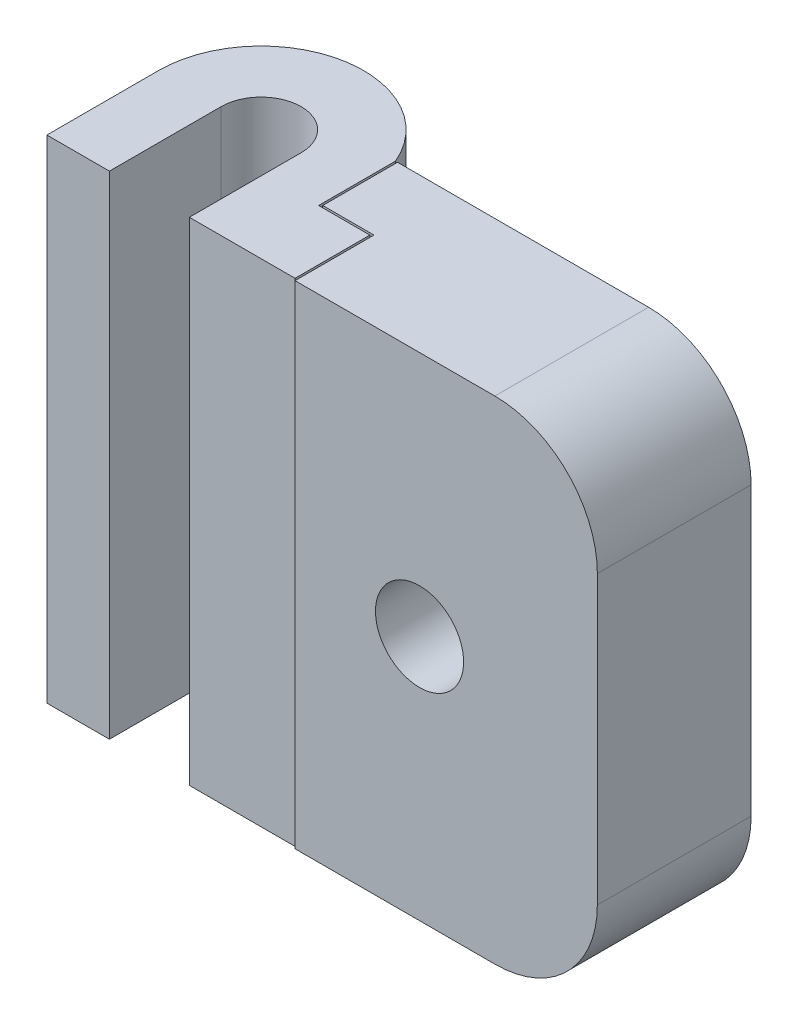
ISO-10303-21;
HEADER;
FILE_DESCRIPTION(('STEP AP214'),'2;1');
FILE_NAME('part.step','',(''),(''),'','','');
FILE_SCHEMA(('AUTOMOTIVE_DESIGN { 1 0 10303 214 1 1 1 1 }'));
ENDSEC;
DATA;
#1=APPLICATION_CONTEXT('core data for automotive mechanical design processes');
#2=APPLICATION_PROTOCOL_DEFINITION('international standard','automotive_design',2000,#1);
#3=PRODUCT_CONTEXT('',#1,'mechanical');
#4=PRODUCT('Part','Part','',(#3));
#5=PRODUCT_RELATED_PRODUCT_CATEGORY('part','',(#4));
#6=PRODUCT_DEFINITION_FORMATION('','',#4);
#7=PRODUCT_DEFINITION_CONTEXT('part definition',#1,'design');
#8=PRODUCT_DEFINITION('design','',#6,#7);
#9=PRODUCT_DEFINITION_SHAPE('','',#8);
#10=(LENGTH_UNIT() NAMED_UNIT(*) SI_UNIT(.MILLI.,.METRE.));
#11=(NAMED_UNIT(*) PLANE_ANGLE_UNIT() SI_UNIT($,.RADIAN.));
#12=(NAMED_UNIT(*) SI_UNIT($,.STERADIAN.) SOLID_ANGLE_UNIT());
#13=UNCERTAINTY_MEASURE_WITH_UNIT(LENGTH_MEASURE(1.E-05),#10,'distance_accuracy_value','');
#14=(GEOMETRIC_REPRESENTATION_CONTEXT(3) GLOBAL_UNCERTAINTY_ASSIGNED_CONTEXT((#13)) GLOBAL_UNIT_ASSIGNED_CONTEXT((#10,
#11,#12)) REPRESENTATION_CONTEXT('',''));
#15=CARTESIAN_POINT('',(0.,0.,0.));
#16=DIRECTION('',(0.,0.,1.));
#17=DIRECTION('',(1.,0.,0.));
#18=AXIS2_PLACEMENT_3D('',#15,#16,#17);
#19=CARTESIAN_POINT('',(13.2770371413164,12.,5.55));
#20=DIRECTION('',(0.,0.,-1.));
#21=DIRECTION('',(-1.,0.,0.));
#22=AXIS2_PLACEMENT_3D('',#19,#20,#21);
#23=CYLINDRICAL_SURFACE('',#22,2.15);
#24=CARTESIAN_POINT('',(13.2770371413164,12.,5.55));
#25=DIRECTION('',(0.,0.,-1.));
#26=DIRECTION('',(-1.,0.,0.));
#27=AXIS2_PLACEMENT_3D('',#24,#25,#26);
#28=CIRCLE('',#27,2.15);
#29=CARTESIAN_POINT('',(11.1270371413164,12.,5.55));
#30=VERTEX_POINT('',#29);
#31=EDGE_CURVE('E150',#30,#30,#28,.T.);
#32=ORIENTED_EDGE('',*,*,#31,.F.);
#33=EDGE_LOOP('',(#32));
#34=FACE_BOUND('',#33,.T.);
#35=CARTESIAN_POINT('',(13.2770371413164,12.,1.65));
#36=DIRECTION('',(0.,0.,-1.));
#37=DIRECTION('',(-1.,0.,0.));
#38=AXIS2_PLACEMENT_3D('',#35,#36,#37);
#39=CIRCLE('',#38,2.15);
#40=CARTESIAN_POINT('',(11.1270371413164,12.,1.65));
#41=VERTEX_POINT('',#40);
#42=EDGE_CURVE('E12',#41,#41,#39,.F.);
#43=ORIENTED_EDGE('',*,*,#42,.F.);
#44=EDGE_LOOP('',(#43));
#45=FACE_BOUND('',#44,.T.);
#46=ADVANCED_FACE('F45',(#34,#45),#23,.F.);
#47=CARTESIAN_POINT('',(1.95,24.,5.55));
#48=DIRECTION('',(0.,0.,-1.));
#49=DIRECTION('',(-1.,0.,0.));
#50=AXIS2_PLACEMENT_3D('',#47,#48,#49);
#51=PLANE('',#50);
#52=ORIENTED_EDGE('',*,*,#31,.T.);
#53=EDGE_LOOP('',(#52));
#54=FACE_BOUND('',#53,.T.);
#55=DIRECTION('',(1.,0.,0.));
#56=VECTOR('',#55,1.);
#57=CARTESIAN_POINT('',(1.95,24.,5.55));
#58=LINE('',#57,#56);
#59=CARTESIAN_POINT('',(7.20407428263272,24.,5.55));
#60=VERTEX_POINT('',#59);
#61=CARTESIAN_POINT('',(16.95,24.,5.55));
#62=VERTEX_POINT('',#61);
#63=EDGE_CURVE('E170',#60,#62,#58,.T.);
#64=ORIENTED_EDGE('',*,*,#63,.F.);
#65=DIRECTION('',(0.,-1.,0.));
#66=VECTOR('',#65,1.);
#67=CARTESIAN_POINT('',(7.20407428263272,24.,5.55));
#68=LINE('',#67,#66);
#69=CARTESIAN_POINT('',(7.20407428263272,0.,5.55));
#70=VERTEX_POINT('',#69);
#71=EDGE_CURVE('E153',#60,#70,#68,.T.);
#72=ORIENTED_EDGE('',*,*,#71,.T.);
#73=DIRECTION('',(1.,0.,0.));
#74=VECTOR('',#73,1.);
#75=CARTESIAN_POINT('',(1.95,0.,5.55));
#76=LINE('',#75,#74);
#77=CARTESIAN_POINT('',(16.95,0.,5.55));
#78=VERTEX_POINT('',#77);
#79=EDGE_CURVE('E163',#70,#78,#76,.T.);
#80=ORIENTED_EDGE('',*,*,#79,.T.);
#81=CARTESIAN_POINT('',(16.95,5.,5.55));
#82=DIRECTION('',(0.,0.,-1.));
#83=DIRECTION('',(-1.,0.,0.));
#84=AXIS2_PLACEMENT_3D('',#81,#82,#83);
#85=CIRCLE('',#84,5.);
#86=CARTESIAN_POINT('',(21.95,5.,5.55));
#87=VERTEX_POINT('',#86);
#88=EDGE_CURVE('E178',#78,#87,#85,.F.);
#89=ORIENTED_EDGE('',*,*,#88,.T.);
#90=DIRECTION('',(0.,-1.,0.));
#91=VECTOR('',#90,1.);
#92=CARTESIAN_POINT('',(21.95,24.,5.55));
#93=LINE('',#92,#91);
#94=CARTESIAN_POINT('',(21.95,19.,5.55));
#95=VERTEX_POINT('',#94);
#96=EDGE_CURVE('E135',#95,#87,#93,.T.);
#97=ORIENTED_EDGE('',*,*,#96,.F.);
#98=CARTESIAN_POINT('',(16.95,19.,5.55));
#99=DIRECTION('',(0.,0.,-1.));
#100=DIRECTION('',(-1.,0.,0.));
#101=AXIS2_PLACEMENT_3D('',#98,#99,#100);
#102=CIRCLE('',#101,5.);
#103=EDGE_CURVE('E132',#95,#62,#102,.F.);
#104=ORIENTED_EDGE('',*,*,#103,.T.);
#105=EDGE_LOOP('',(#64,#72,#80,#89,#97,#104));
#106=FACE_BOUND('',#105,.T.);
#107=ADVANCED_FACE('F47',(#54,#106),#51,.F.);
#108=CARTESIAN_POINT('',(21.95,24.,0.));
#109=DIRECTION('',(-1.,0.,0.));
#110=DIRECTION('',(0.,0.,1.));
#111=AXIS2_PLACEMENT_3D('',#108,#109,#110);
#112=PLANE('',#111);
#113=ORIENTED_EDGE('',*,*,#96,.T.);
#114=DIRECTION('',(0.,0.,-1.));
#115=VECTOR('',#114,1.);
#116=CARTESIAN_POINT('',(21.95,5.,0.));
#117=LINE('',#116,#115);
#118=CARTESIAN_POINT('',(21.95,5.,-1.95));
#119=VERTEX_POINT('',#118);
#120=EDGE_CURVE('E126',#87,#119,#117,.T.);
#121=ORIENTED_EDGE('',*,*,#120,.T.);
#122=DIRECTION('',(0.,-1.,0.));
#123=VECTOR('',#122,1.);
#124=CARTESIAN_POINT('',(21.95,24.,-1.95));
#125=LINE('',#124,#123);
#126=CARTESIAN_POINT('',(21.95,19.,-1.95));
#127=VERTEX_POINT('',#126);
#128=EDGE_CURVE('E113',#127,#119,#125,.T.);
#129=ORIENTED_EDGE('',*,*,#128,.F.);
#130=DIRECTION('',(0.,0.,-1.));
#131=VECTOR('',#130,1.);
#132=CARTESIAN_POINT('',(21.95,19.,5.55));
#133=LINE('',#132,#131);
#134=EDGE_CURVE('E123',#127,#95,#133,.F.);
#135=ORIENTED_EDGE('',*,*,#134,.T.);
#136=EDGE_LOOP('',(#113,#121,#129,#135));
#137=FACE_BOUND('',#136,.T.);
#138=ADVANCED_FACE('F122',(#137),#112,.F.);
#139=CARTESIAN_POINT('',(21.95,24.,-1.95));
#140=DIRECTION('',(0.,0.,1.));
#141=DIRECTION('',(1.,0.,0.));
#142=AXIS2_PLACEMENT_3D('',#139,#140,#141);
#143=PLANE('',#142);
#144=CARTESIAN_POINT('',(13.2770371413164,12.,-1.95));
#145=DIRECTION('',(0.,0.,-1.));
#146=DIRECTION('',(-1.,0.,0.));
#147=AXIS2_PLACEMENT_3D('',#144,#145,#146);
#148=CIRCLE('',#147,4.1);
#149=CARTESIAN_POINT('',(9.17703714131636,12.,-1.95));
#150=VERTEX_POINT('',#149);
#151=EDGE_CURVE('E142',#150,#150,#148,.T.);
#152=ORIENTED_EDGE('',*,*,#151,.F.);
#153=EDGE_LOOP('',(#152));
#154=FACE_BOUND('',#153,.T.);
#155=DIRECTION('',(-1.,0.,0.));
#156=VECTOR('',#155,1.);
#157=CARTESIAN_POINT('',(21.95,0.,-1.95));
#158=LINE('',#157,#156);
#159=CARTESIAN_POINT('',(16.95,0.,-1.95));
#160=VERTEX_POINT('',#159);
#161=CARTESIAN_POINT('',(4.70407428263272,0.,-1.95));
#162=VERTEX_POINT('',#161);
#163=EDGE_CURVE('E117',#160,#162,#158,.T.);
#164=ORIENTED_EDGE('',*,*,#163,.T.);
#165=DIRECTION('',(0.,-1.,0.));
#166=VECTOR('',#165,1.);
#167=CARTESIAN_POINT('',(4.70407428263272,24.,-1.95));
#168=LINE('',#167,#166);
#169=CARTESIAN_POINT('',(4.70407428263272,24.,-1.95));
#170=VERTEX_POINT('',#169);
#171=EDGE_CURVE('E154',#170,#162,#168,.T.);
#172=ORIENTED_EDGE('',*,*,#171,.F.);
#173=DIRECTION('',(-1.,0.,0.));
#174=VECTOR('',#173,1.);
#175=CARTESIAN_POINT('',(21.95,24.,-1.95));
#176=LINE('',#175,#174);
#177=CARTESIAN_POINT('',(16.95,24.,-1.95));
#178=VERTEX_POINT('',#177);
#179=EDGE_CURVE('E116',#178,#170,#176,.T.);
#180=ORIENTED_EDGE('',*,*,#179,.F.);
#181=CARTESIAN_POINT('',(16.95,19.,-1.95));
#182=DIRECTION('',(0.,0.,1.));
#183=DIRECTION('',(1.,0.,0.));
#184=AXIS2_PLACEMENT_3D('',#181,#182,#183);
#185=CIRCLE('',#184,5.);
#186=EDGE_CURVE('E89',#178,#127,#185,.F.);
#187=ORIENTED_EDGE('',*,*,#186,.T.);
#188=ORIENTED_EDGE('',*,*,#128,.T.);
#189=CARTESIAN_POINT('',(16.95,5.,-1.95));
#190=DIRECTION('',(0.,0.,1.));
#191=DIRECTION('',(1.,0.,0.));
#192=AXIS2_PLACEMENT_3D('',#189,#190,#191);
#193=CIRCLE('',#192,5.);
#194=EDGE_CURVE('E127',#119,#160,#193,.F.);
#195=ORIENTED_EDGE('',*,*,#194,.T.);
#196=EDGE_LOOP('',(#164,#172,#180,#187,#188,#195));
#197=FACE_BOUND('',#196,.T.);
#198=ADVANCED_FACE('F112',(#154,#197),#143,.F.);
#199=CARTESIAN_POINT('',(0.,24.,0.));
#200=DIRECTION('',(0.,1.,0.));
#201=DIRECTION('',(0.,0.,1.));
#202=AXIS2_PLACEMENT_3D('',#199,#200,#201);
#203=PLANE('',#202);
#204=DIRECTION('',(0.,0.,1.));
#205=VECTOR('',#204,1.);
#206=CARTESIAN_POINT('',(7.20407428263272,24.,1.7));
#207=LINE('',#206,#205);
#208=CARTESIAN_POINT('',(7.20407428263272,24.,1.7));
#209=VERTEX_POINT('',#208);
#210=EDGE_CURVE('E167',#209,#60,#207,.T.);
#211=ORIENTED_EDGE('',*,*,#210,.T.);
#212=ORIENTED_EDGE('',*,*,#63,.T.);
#213=DIRECTION('',(0.,0.,-1.));
#214=VECTOR('',#213,1.);
#215=CARTESIAN_POINT('',(16.95,24.,-1.95));
#216=LINE('',#215,#214);
#217=EDGE_CURVE('E141',#62,#178,#216,.T.);
#218=ORIENTED_EDGE('',*,*,#217,.T.);
#219=ORIENTED_EDGE('',*,*,#179,.T.);
#220=DIRECTION('',(0.,0.,1.));
#221=VECTOR('',#220,1.);
#222=CARTESIAN_POINT('',(4.70407428263272,24.,-1.95));
#223=LINE('',#222,#221);
#224=CARTESIAN_POINT('',(4.70407428263272,24.,1.7));
#225=VERTEX_POINT('',#224);
#226=EDGE_CURVE('E140',#170,#225,#223,.T.);
#227=ORIENTED_EDGE('',*,*,#226,.T.);
#228=DIRECTION('',(1.,0.,0.));
#229=VECTOR('',#228,1.);
#230=CARTESIAN_POINT('',(4.70407428263272,24.,1.7));
#231=LINE('',#230,#229);
#232=EDGE_CURVE('E171',#225,#209,#231,.T.);
#233=ORIENTED_EDGE('',*,*,#232,.T.);
#234=EDGE_LOOP('',(#211,#212,#218,#219,#227,#233));
#235=FACE_BOUND('',#234,.T.);
#236=ADVANCED_FACE('F204',(#235),#203,.T.);
#237=CARTESIAN_POINT('',(0.,0.,0.));
#238=DIRECTION('',(0.,1.,0.));
#239=DIRECTION('',(0.,0.,1.));
#240=AXIS2_PLACEMENT_3D('',#237,#238,#239);
#241=PLANE('',#240);
#242=ORIENTED_EDGE('',*,*,#79,.F.);
#243=DIRECTION('',(0.,0.,1.));
#244=VECTOR('',#243,1.);
#245=CARTESIAN_POINT('',(7.20407428263272,0.,1.7));
#246=LINE('',#245,#244);
#247=CARTESIAN_POINT('',(7.20407428263272,0.,1.7));
#248=VERTEX_POINT('',#247);
#249=EDGE_CURVE('E159',#248,#70,#246,.T.);
#250=ORIENTED_EDGE('',*,*,#249,.F.);
#251=DIRECTION('',(1.,0.,0.));
#252=VECTOR('',#251,1.);
#253=CARTESIAN_POINT('',(4.70407428263272,0.,1.7));
#254=LINE('',#253,#252);
#255=CARTESIAN_POINT('',(4.70407428263272,0.,1.7));
#256=VERTEX_POINT('',#255);
#257=EDGE_CURVE('E157',#256,#248,#254,.T.);
#258=ORIENTED_EDGE('',*,*,#257,.F.);
#259=DIRECTION('',(0.,0.,1.));
#260=VECTOR('',#259,1.);
#261=CARTESIAN_POINT('',(4.70407428263272,0.,-1.95));
#262=LINE('',#261,#260);
#263=EDGE_CURVE('E149',#162,#256,#262,.T.);
#264=ORIENTED_EDGE('',*,*,#263,.F.);
#265=ORIENTED_EDGE('',*,*,#163,.F.);
#266=DIRECTION('',(0.,0.,-1.));
#267=VECTOR('',#266,1.);
#268=CARTESIAN_POINT('',(16.95,0.,0.));
#269=LINE('',#268,#267);
#270=EDGE_CURVE('E146',#160,#78,#269,.F.);
#271=ORIENTED_EDGE('',*,*,#270,.T.);
#272=EDGE_LOOP('',(#242,#250,#258,#264,#265,#271));
#273=FACE_BOUND('',#272,.T.);
#274=ADVANCED_FACE('F193',(#273),#241,.F.);
#275=CARTESIAN_POINT('',(16.95,5.,0.));
#276=DIRECTION('',(0.,0.,-1.));
#277=DIRECTION('',(-1.,0.,0.));
#278=AXIS2_PLACEMENT_3D('',#275,#276,#277);
#279=CYLINDRICAL_SURFACE('',#278,5.);
#280=ORIENTED_EDGE('',*,*,#88,.F.);
#281=ORIENTED_EDGE('',*,*,#270,.F.);
#282=ORIENTED_EDGE('',*,*,#194,.F.);
#283=ORIENTED_EDGE('',*,*,#120,.F.);
#284=EDGE_LOOP('',(#280,#281,#282,#283));
#285=FACE_BOUND('',#284,.T.);
#286=ADVANCED_FACE('F195',(#285),#279,.T.);
#287=CARTESIAN_POINT('',(16.95,19.,0.));
#288=DIRECTION('',(0.,0.,1.));
#289=DIRECTION('',(1.,0.,0.));
#290=AXIS2_PLACEMENT_3D('',#287,#288,#289);
#291=CYLINDRICAL_SURFACE('',#290,5.);
#292=ORIENTED_EDGE('',*,*,#103,.F.);
#293=ORIENTED_EDGE('',*,*,#134,.F.);
#294=ORIENTED_EDGE('',*,*,#186,.F.);
#295=ORIENTED_EDGE('',*,*,#217,.F.);
#296=EDGE_LOOP('',(#292,#293,#294,#295));
#297=FACE_BOUND('',#296,.T.);
#298=ADVANCED_FACE('F130',(#297),#291,.T.);
#299=CARTESIAN_POINT('',(13.2770371413164,12.,1.05));
#300=DIRECTION('',(0.,0.,-1.));
#301=DIRECTION('',(-1.,0.,0.));
#302=AXIS2_PLACEMENT_3D('',#299,#300,#301);
#303=CYLINDRICAL_SURFACE('',#302,4.1);
#304=CARTESIAN_POINT('',(13.2770371413164,12.,1.05));
#305=DIRECTION('',(0.,0.,-1.));
#306=DIRECTION('',(-1.,0.,0.));
#307=AXIS2_PLACEMENT_3D('',#304,#305,#306);
#308=CIRCLE('',#307,4.1);
#309=CARTESIAN_POINT('',(9.17703714131636,12.,1.05));
#310=VERTEX_POINT('',#309);
#311=EDGE_CURVE('E145',#310,#310,#308,.T.);
#312=ORIENTED_EDGE('',*,*,#311,.F.);
#313=EDGE_LOOP('',(#312));
#314=FACE_BOUND('',#313,.T.);
#315=ORIENTED_EDGE('',*,*,#151,.T.);
#316=EDGE_LOOP('',(#315));
#317=FACE_BOUND('',#316,.T.);
#318=ADVANCED_FACE('F202',(#314,#317),#303,.F.);
#319=CARTESIAN_POINT('',(13.2770371413164,12.,1.05));
#320=DIRECTION('',(0.,0.,-1.));
#321=DIRECTION('',(-1.,0.,0.));
#322=AXIS2_PLACEMENT_3D('',#319,#320,#321);
#323=PLANE('',#322);
#324=ORIENTED_EDGE('',*,*,#311,.T.);
#325=EDGE_LOOP('',(#324));
#326=FACE_BOUND('',#325,.T.);
#327=ADVANCED_FACE('F219',(#326),#323,.T.);
#328=CARTESIAN_POINT('',(4.70407428263272,24.,-1.95));
#329=DIRECTION('',(1.,0.,0.));
#330=DIRECTION('',(0.,0.,-1.));
#331=AXIS2_PLACEMENT_3D('',#328,#329,#330);
#332=PLANE('',#331);
#333=ORIENTED_EDGE('',*,*,#263,.T.);
#334=DIRECTION('',(0.,-1.,0.));
#335=VECTOR('',#334,1.);
#336=CARTESIAN_POINT('',(4.70407428263272,24.,1.7));
#337=LINE('',#336,#335);
#338=EDGE_CURVE('E80',#225,#256,#337,.T.);
#339=ORIENTED_EDGE('',*,*,#338,.F.);
#340=ORIENTED_EDGE('',*,*,#226,.F.);
#341=ORIENTED_EDGE('',*,*,#171,.T.);
#342=EDGE_LOOP('',(#333,#339,#340,#341));
#343=FACE_BOUND('',#342,.T.);
#344=ADVANCED_FACE('F221',(#343),#332,.F.);
#345=CARTESIAN_POINT('',(4.70407428263272,24.,1.7));
#346=DIRECTION('',(0.,0.,-1.));
#347=DIRECTION('',(-1.,0.,0.));
#348=AXIS2_PLACEMENT_3D('',#345,#346,#347);
#349=PLANE('',#348);
#350=ORIENTED_EDGE('',*,*,#257,.T.);
#351=DIRECTION('',(0.,-1.,0.));
#352=VECTOR('',#351,1.);
#353=CARTESIAN_POINT('',(7.20407428263272,24.,1.7));
#354=LINE('',#353,#352);
#355=EDGE_CURVE('E54',#209,#248,#354,.T.);
#356=ORIENTED_EDGE('',*,*,#355,.F.);
#357=ORIENTED_EDGE('',*,*,#232,.F.);
#358=ORIENTED_EDGE('',*,*,#338,.T.);
#359=EDGE_LOOP('',(#350,#356,#357,#358));
#360=FACE_BOUND('',#359,.T.);
#361=ADVANCED_FACE('F224',(#360),#349,.F.);
#362=CARTESIAN_POINT('',(7.20407428263272,24.,1.7));
#363=DIRECTION('',(1.,0.,0.));
#364=DIRECTION('',(0.,0.,-1.));
#365=AXIS2_PLACEMENT_3D('',#362,#363,#364);
#366=PLANE('',#365);
#367=ORIENTED_EDGE('',*,*,#249,.T.);
#368=ORIENTED_EDGE('',*,*,#71,.F.);
#369=ORIENTED_EDGE('',*,*,#210,.F.);
#370=ORIENTED_EDGE('',*,*,#355,.T.);
#371=EDGE_LOOP('',(#367,#368,#369,#370));
#372=FACE_BOUND('',#371,.T.);
#373=ADVANCED_FACE('F227',(#372),#366,.F.);
#374=CARTESIAN_POINT('',(13.2770371413164,12.,1.65));
#375=DIRECTION('',(0.,0.,-1.));
#376=DIRECTION('',(-1.,0.,0.));
#377=AXIS2_PLACEMENT_3D('',#374,#375,#376);
#378=PLANE('',#377);
#379=ORIENTED_EDGE('',*,*,#42,.T.);
#380=EDGE_LOOP('',(#379));
#381=FACE_BOUND('',#380,.T.);
#382=ADVANCED_FACE('F231',(#381),#378,.F.);
#383=CLOSED_SHELL('',(#46,#107,#138,#198,#236,#274,#286,#298,#318,#327,#344,#361,#373,#382));
#384=MANIFOLD_SOLID_BREP('B2',#383);
#385=CARTESIAN_POINT('',(-5.,24.,0.));
#386=DIRECTION('',(1.,0.,0.));
#387=DIRECTION('',(0.,0.,-1.));
#388=AXIS2_PLACEMENT_3D('',#385,#386,#387);
#389=PLANE('',#388);
#390=DIRECTION('',(0.,-1.,0.));
#391=VECTOR('',#390,1.);
#392=CARTESIAN_POINT('',(-5.,24.,5.45));
#393=LINE('',#392,#391);
#394=CARTESIAN_POINT('',(-5.,24.,5.45));
#395=VERTEX_POINT('',#394);
#396=CARTESIAN_POINT('',(-5.,0.,5.45));
#397=VERTEX_POINT('',#396);
#398=EDGE_CURVE('E359',#395,#397,#393,.T.);
#399=ORIENTED_EDGE('',*,*,#398,.F.);
#400=DIRECTION('',(0.,0.,1.));
#401=VECTOR('',#400,1.);
#402=CARTESIAN_POINT('',(-5.,24.,0.));
#403=LINE('',#402,#401);
#404=CARTESIAN_POINT('',(-5.,24.,0.));
#405=VERTEX_POINT('',#404);
#406=EDGE_CURVE('E478',#405,#395,#403,.T.);
#407=ORIENTED_EDGE('',*,*,#406,.F.);
#408=DIRECTION('',(0.,-1.,0.));
#409=VECTOR('',#408,1.);
#410=CARTESIAN_POINT('',(-5.,24.,0.));
#411=LINE('',#410,#409);
#412=CARTESIAN_POINT('',(-5.,0.,0.));
#413=VERTEX_POINT('',#412);
#414=EDGE_CURVE('E457',#405,#413,#411,.T.);
#415=ORIENTED_EDGE('',*,*,#414,.T.);
#416=DIRECTION('',(0.,0.,1.));
#417=VECTOR('',#416,1.);
#418=CARTESIAN_POINT('',(-5.,0.,0.));
#419=LINE('',#418,#417);
#420=EDGE_CURVE('E443',#413,#397,#419,.T.);
#421=ORIENTED_EDGE('',*,*,#420,.T.);
#422=EDGE_LOOP('',(#399,#407,#415,#421));
#423=FACE_BOUND('',#422,.T.);
#424=ADVANCED_FACE('F344',(#423),#389,.F.);
#425=CARTESIAN_POINT('',(-1.95,24.,0.));
#426=DIRECTION('',(-1.,0.,0.));
#427=DIRECTION('',(0.,0.,1.));
#428=AXIS2_PLACEMENT_3D('',#425,#426,#427);
#429=PLANE('',#428);
#430=DIRECTION('',(0.,1.,0.));
#431=VECTOR('',#430,1.);
#432=CARTESIAN_POINT('',(-1.95,0.,5.45));
#433=LINE('',#432,#431);
#434=CARTESIAN_POINT('',(-1.95,0.,5.45));
#435=VERTEX_POINT('',#434);
#436=CARTESIAN_POINT('',(-1.95,24.,5.45));
#437=VERTEX_POINT('',#436);
#438=EDGE_CURVE('E505',#435,#437,#433,.T.);
#439=ORIENTED_EDGE('',*,*,#438,.F.);
#440=DIRECTION('',(0.,0.,-1.));
#441=VECTOR('',#440,1.);
#442=CARTESIAN_POINT('',(-1.95,0.,0.));
#443=LINE('',#442,#441);
#444=CARTESIAN_POINT('',(-1.95,0.,0.));
#445=VERTEX_POINT('',#444);
#446=EDGE_CURVE('E451',#435,#445,#443,.T.);
#447=ORIENTED_EDGE('',*,*,#446,.T.);
#448=DIRECTION('',(0.,-1.,0.));
#449=VECTOR('',#448,1.);
#450=CARTESIAN_POINT('',(-1.95,24.,0.));
#451=LINE('',#450,#449);
#452=CARTESIAN_POINT('',(-1.95,24.,0.));
#453=VERTEX_POINT('',#452);
#454=EDGE_CURVE('E454',#453,#445,#451,.T.);
#455=ORIENTED_EDGE('',*,*,#454,.F.);
#456=DIRECTION('',(0.,0.,-1.));
#457=VECTOR('',#456,1.);
#458=CARTESIAN_POINT('',(-1.95,24.,0.));
#459=LINE('',#458,#457);
#460=EDGE_CURVE('E458',#437,#453,#459,.T.);
#461=ORIENTED_EDGE('',*,*,#460,.F.);
#462=EDGE_LOOP('',(#439,#447,#455,#461));
#463=FACE_BOUND('',#462,.T.);
#464=ADVANCED_FACE('F529',(#463),#429,.F.);
#465=CARTESIAN_POINT('',(1.95,24.,0.));
#466=DIRECTION('',(1.,0.,0.));
#467=DIRECTION('',(0.,0.,-1.));
#468=AXIS2_PLACEMENT_3D('',#465,#466,#467);
#469=PLANE('',#468);
#470=DIRECTION('',(0.,-1.,0.));
#471=VECTOR('',#470,1.);
#472=CARTESIAN_POINT('',(1.95,24.,5.45));
#473=LINE('',#472,#471);
#474=CARTESIAN_POINT('',(1.95,24.,5.45));
#475=VERTEX_POINT('',#474);
#476=CARTESIAN_POINT('',(1.95,0.,5.45));
#477=VERTEX_POINT('',#476);
#478=EDGE_CURVE('E419',#475,#477,#473,.T.);
#479=ORIENTED_EDGE('',*,*,#478,.F.);
#480=DIRECTION('',(0.,0.,1.));
#481=VECTOR('',#480,1.);
#482=CARTESIAN_POINT('',(1.95,24.,0.));
#483=LINE('',#482,#481);
#484=CARTESIAN_POINT('',(1.95,24.,0.));
#485=VERTEX_POINT('',#484);
#486=EDGE_CURVE('E482',#485,#475,#483,.T.);
#487=ORIENTED_EDGE('',*,*,#486,.F.);
#488=DIRECTION('',(0.,-1.,0.));
#489=VECTOR('',#488,1.);
#490=CARTESIAN_POINT('',(1.95,24.,0.));
#491=LINE('',#490,#489);
#492=CARTESIAN_POINT('',(1.95,0.,0.));
#493=VERTEX_POINT('',#492);
#494=EDGE_CURVE('E43',#485,#493,#491,.T.);
#495=ORIENTED_EDGE('',*,*,#494,.T.);
#496=DIRECTION('',(0.,0.,1.));
#497=VECTOR('',#496,1.);
#498=CARTESIAN_POINT('',(1.95,0.,0.));
#499=LINE('',#498,#497);
#500=EDGE_CURVE('E432',#493,#477,#499,.T.);
#501=ORIENTED_EDGE('',*,*,#500,.T.);
#502=EDGE_LOOP('',(#479,#487,#495,#501));
#503=FACE_BOUND('',#502,.T.);
#504=ADVANCED_FACE('F437',(#503),#469,.F.);
#505=CARTESIAN_POINT('',(0.,24.,0.));
#506=DIRECTION('',(0.,1.,0.));
#507=DIRECTION('',(0.,0.,1.));
#508=AXIS2_PLACEMENT_3D('',#505,#506,#507);
#509=PLANE('',#508);
#510=ORIENTED_EDGE('',*,*,#486,.T.);
#511=DIRECTION('',(-1.,0.,0.));
#512=VECTOR('',#511,1.);
#513=CARTESIAN_POINT('',(7.10407428263272,24.,5.45));
#514=LINE('',#513,#512);
#515=CARTESIAN_POINT('',(7.10407428263272,24.,5.45));
#516=VERTEX_POINT('',#515);
#517=EDGE_CURVE('E422',#516,#475,#514,.T.);
#518=ORIENTED_EDGE('',*,*,#517,.F.);
#519=DIRECTION('',(0.,0.,-1.));
#520=VECTOR('',#519,1.);
#521=CARTESIAN_POINT('',(7.10407428263272,24.,1.8));
#522=LINE('',#521,#520);
#523=CARTESIAN_POINT('',(7.10407428263272,24.,1.8));
#524=VERTEX_POINT('',#523);
#525=EDGE_CURVE('E494',#516,#524,#522,.T.);
#526=ORIENTED_EDGE('',*,*,#525,.T.);
#527=DIRECTION('',(-1.,0.,0.));
#528=VECTOR('',#527,1.);
#529=CARTESIAN_POINT('',(4.60407428263272,24.,1.8));
#530=LINE('',#529,#528);
#531=CARTESIAN_POINT('',(4.60407428263272,24.,1.8));
#532=VERTEX_POINT('',#531);
#533=EDGE_CURVE('E500',#524,#532,#530,.T.);
#534=ORIENTED_EDGE('',*,*,#533,.T.);
#535=DIRECTION('',(0.,0.,-1.));
#536=VECTOR('',#535,1.);
#537=CARTESIAN_POINT('',(4.60407428263272,24.,-1.95));
#538=LINE('',#537,#536);
#539=CARTESIAN_POINT('',(4.60407428263272,24.,-1.95));
#540=VERTEX_POINT('',#539);
#541=EDGE_CURVE('E491',#532,#540,#538,.T.);
#542=ORIENTED_EDGE('',*,*,#541,.T.);
#543=CARTESIAN_POINT('',(0.,24.,0.));
#544=DIRECTION('',(0.,1.,0.));
#545=DIRECTION('',(0.,0.,1.));
#546=AXIS2_PLACEMENT_3D('',#543,#544,#545);
#547=CIRCLE('',#546,5.);
#548=EDGE_CURVE('E466',#540,#405,#547,.T.);
#549=ORIENTED_EDGE('',*,*,#548,.T.);
#550=ORIENTED_EDGE('',*,*,#406,.T.);
#551=DIRECTION('',(-1.,0.,0.));
#552=VECTOR('',#551,1.);
#553=CARTESIAN_POINT('',(-1.95,24.,5.45));
#554=LINE('',#553,#552);
#555=EDGE_CURVE('E426',#437,#395,#554,.T.);
#556=ORIENTED_EDGE('',*,*,#555,.F.);
#557=ORIENTED_EDGE('',*,*,#460,.T.);
#558=CARTESIAN_POINT('',(0.,24.,0.));
#559=DIRECTION('',(0.,-1.,0.));
#560=DIRECTION('',(0.,0.,1.));
#561=AXIS2_PLACEMENT_3D('',#558,#559,#560);
#562=CIRCLE('',#561,1.95);
#563=EDGE_CURVE('E453',#453,#485,#562,.T.);
#564=ORIENTED_EDGE('',*,*,#563,.T.);
#565=EDGE_LOOP('',(#510,#518,#526,#534,#542,#549,#550,#556,#557,#564));
#566=FACE_BOUND('',#565,.T.);
#567=ADVANCED_FACE('F512',(#566),#509,.T.);
#568=CARTESIAN_POINT('',(0.,0.,0.));
#569=DIRECTION('',(0.,1.,0.));
#570=DIRECTION('',(0.,0.,1.));
#571=AXIS2_PLACEMENT_3D('',#568,#569,#570);
#572=PLANE('',#571);
#573=DIRECTION('',(1.,0.,0.));
#574=VECTOR('',#573,1.);
#575=CARTESIAN_POINT('',(1.95,0.,5.45));
#576=LINE('',#575,#574);
#577=CARTESIAN_POINT('',(7.10407428263272,0.,5.45));
#578=VERTEX_POINT('',#577);
#579=EDGE_CURVE('E367',#477,#578,#576,.T.);
#580=ORIENTED_EDGE('',*,*,#579,.F.);
#581=ORIENTED_EDGE('',*,*,#500,.F.);
#582=CARTESIAN_POINT('',(0.,0.,0.));
#583=DIRECTION('',(0.,-1.,0.));
#584=DIRECTION('',(0.,0.,1.));
#585=AXIS2_PLACEMENT_3D('',#582,#583,#584);
#586=CIRCLE('',#585,1.95);
#587=EDGE_CURVE('E441',#445,#493,#586,.T.);
#588=ORIENTED_EDGE('',*,*,#587,.F.);
#589=ORIENTED_EDGE('',*,*,#446,.F.);
#590=DIRECTION('',(1.,0.,0.));
#591=VECTOR('',#590,1.);
#592=CARTESIAN_POINT('',(-5.,0.,5.45));
#593=LINE('',#592,#591);
#594=EDGE_CURVE('E474',#397,#435,#593,.T.);
#595=ORIENTED_EDGE('',*,*,#594,.F.);
#596=ORIENTED_EDGE('',*,*,#420,.F.);
#597=CARTESIAN_POINT('',(0.,0.,0.));
#598=DIRECTION('',(0.,1.,0.));
#599=DIRECTION('',(0.,0.,1.));
#600=AXIS2_PLACEMENT_3D('',#597,#598,#599);
#601=CIRCLE('',#600,5.);
#602=CARTESIAN_POINT('',(4.60407428263272,0.,-1.95));
#603=VERTEX_POINT('',#602);
#604=EDGE_CURVE('E440',#603,#413,#601,.T.);
#605=ORIENTED_EDGE('',*,*,#604,.F.);
#606=DIRECTION('',(0.,0.,-1.));
#607=VECTOR('',#606,1.);
#608=CARTESIAN_POINT('',(4.60407428263272,0.,-1.95));
#609=LINE('',#608,#607);
#610=CARTESIAN_POINT('',(4.60407428263272,0.,1.8));
#611=VERTEX_POINT('',#610);
#612=EDGE_CURVE('E472',#611,#603,#609,.T.);
#613=ORIENTED_EDGE('',*,*,#612,.F.);
#614=DIRECTION('',(-1.,0.,0.));
#615=VECTOR('',#614,1.);
#616=CARTESIAN_POINT('',(4.60407428263272,0.,1.8));
#617=LINE('',#616,#615);
#618=CARTESIAN_POINT('',(7.10407428263272,0.,1.8));
#619=VERTEX_POINT('',#618);
#620=EDGE_CURVE('E495',#619,#611,#617,.T.);
#621=ORIENTED_EDGE('',*,*,#620,.F.);
#622=DIRECTION('',(0.,0.,-1.));
#623=VECTOR('',#622,1.);
#624=CARTESIAN_POINT('',(7.10407428263272,0.,1.8));
#625=LINE('',#624,#623);
#626=EDGE_CURVE('E434',#578,#619,#625,.T.);
#627=ORIENTED_EDGE('',*,*,#626,.F.);
#628=EDGE_LOOP('',(#580,#581,#588,#589,#595,#596,#605,#613,#621,#627));
#629=FACE_BOUND('',#628,.T.);
#630=ADVANCED_FACE('F430',(#629),#572,.F.);
#631=CARTESIAN_POINT('',(7.10407428263272,24.,1.8));
#632=DIRECTION('',(-1.,0.,0.));
#633=DIRECTION('',(0.,0.,1.));
#634=AXIS2_PLACEMENT_3D('',#631,#632,#633);
#635=PLANE('',#634);
#636=DIRECTION('',(0.,1.,0.));
#637=VECTOR('',#636,1.);
#638=CARTESIAN_POINT('',(7.10407428263272,0.,5.45));
#639=LINE('',#638,#637);
#640=EDGE_CURVE('E435',#578,#516,#639,.T.);
#641=ORIENTED_EDGE('',*,*,#640,.F.);
#642=ORIENTED_EDGE('',*,*,#626,.T.);
#643=DIRECTION('',(0.,-1.,0.));
#644=VECTOR('',#643,1.);
#645=CARTESIAN_POINT('',(7.10407428263272,24.,1.8));
#646=LINE('',#645,#644);
#647=EDGE_CURVE('E488',#524,#619,#646,.T.);
#648=ORIENTED_EDGE('',*,*,#647,.F.);
#649=ORIENTED_EDGE('',*,*,#525,.F.);
#650=EDGE_LOOP('',(#641,#642,#648,#649));
#651=FACE_BOUND('',#650,.T.);
#652=ADVANCED_FACE('F514',(#651),#635,.F.);
#653=CARTESIAN_POINT('',(0.,24.,0.));
#654=DIRECTION('',(0.,-1.,0.));
#655=DIRECTION('',(0.,0.,-1.));
#656=AXIS2_PLACEMENT_3D('',#653,#654,#655);
#657=CYLINDRICAL_SURFACE('',#656,1.95);
#658=ORIENTED_EDGE('',*,*,#587,.T.);
#659=ORIENTED_EDGE('',*,*,#494,.F.);
#660=ORIENTED_EDGE('',*,*,#563,.F.);
#661=ORIENTED_EDGE('',*,*,#454,.T.);
#662=EDGE_LOOP('',(#658,#659,#660,#661));
#663=FACE_BOUND('',#662,.T.);
#664=ADVANCED_FACE('F346',(#663),#657,.F.);
#665=CARTESIAN_POINT('',(0.,24.,0.));
#666=DIRECTION('',(0.,-1.,0.));
#667=DIRECTION('',(0.,0.,-1.));
#668=AXIS2_PLACEMENT_3D('',#665,#666,#667);
#669=CYLINDRICAL_SURFACE('',#668,5.);
#670=ORIENTED_EDGE('',*,*,#604,.T.);
#671=ORIENTED_EDGE('',*,*,#414,.F.);
#672=ORIENTED_EDGE('',*,*,#548,.F.);
#673=DIRECTION('',(0.,-1.,0.));
#674=VECTOR('',#673,1.);
#675=CARTESIAN_POINT('',(4.60407428263272,24.,-1.95));
#676=LINE('',#675,#674);
#677=EDGE_CURVE('E352',#540,#603,#676,.T.);
#678=ORIENTED_EDGE('',*,*,#677,.T.);
#679=EDGE_LOOP('',(#670,#671,#672,#678));
#680=FACE_BOUND('',#679,.T.);
#681=ADVANCED_FACE('F464',(#680),#669,.T.);
#682=CARTESIAN_POINT('',(4.60407428263272,24.,-1.95));
#683=DIRECTION('',(-1.,0.,0.));
#684=DIRECTION('',(0.,0.,1.));
#685=AXIS2_PLACEMENT_3D('',#682,#683,#684);
#686=PLANE('',#685);
#687=ORIENTED_EDGE('',*,*,#612,.T.);
#688=ORIENTED_EDGE('',*,*,#677,.F.);
#689=ORIENTED_EDGE('',*,*,#541,.F.);
#690=DIRECTION('',(0.,-1.,0.));
#691=VECTOR('',#690,1.);
#692=CARTESIAN_POINT('',(4.60407428263272,24.,1.8));
#693=LINE('',#692,#691);
#694=EDGE_CURVE('E445',#532,#611,#693,.T.);
#695=ORIENTED_EDGE('',*,*,#694,.T.);
#696=EDGE_LOOP('',(#687,#688,#689,#695));
#697=FACE_BOUND('',#696,.T.);
#698=ADVANCED_FACE('F518',(#697),#686,.F.);
#699=CARTESIAN_POINT('',(4.60407428263272,24.,1.8));
#700=DIRECTION('',(0.,0.,1.));
#701=DIRECTION('',(1.,0.,0.));
#702=AXIS2_PLACEMENT_3D('',#699,#700,#701);
#703=PLANE('',#702);
#704=ORIENTED_EDGE('',*,*,#620,.T.);
#705=ORIENTED_EDGE('',*,*,#694,.F.);
#706=ORIENTED_EDGE('',*,*,#533,.F.);
#707=ORIENTED_EDGE('',*,*,#647,.T.);
#708=EDGE_LOOP('',(#704,#705,#706,#707));
#709=FACE_BOUND('',#708,.T.);
#710=ADVANCED_FACE('F517',(#709),#703,.F.);
#711=CARTESIAN_POINT('',(0.,0.,5.45));
#712=DIRECTION('',(0.,0.,1.));
#713=DIRECTION('',(1.,0.,0.));
#714=AXIS2_PLACEMENT_3D('',#711,#712,#713);
#715=PLANE('',#714);
#716=ORIENTED_EDGE('',*,*,#478,.T.);
#717=ORIENTED_EDGE('',*,*,#579,.T.);
#718=ORIENTED_EDGE('',*,*,#640,.T.);
#719=ORIENTED_EDGE('',*,*,#517,.T.);
#720=EDGE_LOOP('',(#716,#717,#718,#719));
#721=FACE_BOUND('',#720,.T.);
#722=ADVANCED_FACE('F420',(#721),#715,.T.);
#723=CARTESIAN_POINT('',(0.,0.,5.45));
#724=DIRECTION('',(0.,0.,1.));
#725=DIRECTION('',(1.,0.,0.));
#726=AXIS2_PLACEMENT_3D('',#723,#724,#725);
#727=PLANE('',#726);
#728=ORIENTED_EDGE('',*,*,#398,.T.);
#729=ORIENTED_EDGE('',*,*,#594,.T.);
#730=ORIENTED_EDGE('',*,*,#438,.T.);
#731=ORIENTED_EDGE('',*,*,#555,.T.);
#732=EDGE_LOOP('',(#728,#729,#730,#731));
#733=FACE_BOUND('',#732,.T.);
#734=ADVANCED_FACE('F557',(#733),#727,.T.);
#735=CLOSED_SHELL('',(#424,#464,#504,#567,#630,#652,#664,#681,#698,#710,#722,#734));
#736=MANIFOLD_SOLID_BREP('B6',#735);
#737=ADVANCED_BREP_SHAPE_REPRESENTATION('',(#18,#384,#736),#14);
#738=SHAPE_DEFINITION_REPRESENTATION(#9,#737);
ENDSEC;
END-ISO-10303-21;
